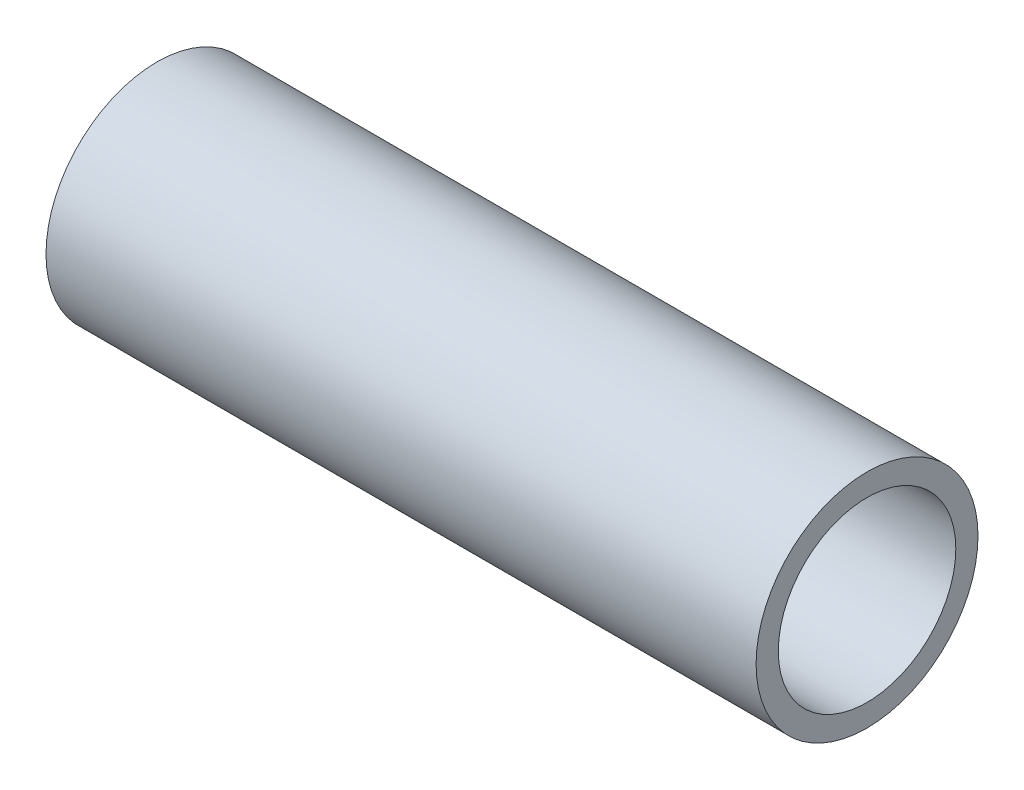
ISO-10303-21;
HEADER;
FILE_DESCRIPTION(('STEP AP214'),'2;1');
FILE_NAME('part.step','',(''),(''),'','','');
FILE_SCHEMA(('AUTOMOTIVE_DESIGN { 1 0 10303 214 1 1 1 1 }'));
ENDSEC;
DATA;
#1=APPLICATION_CONTEXT('core data for automotive mechanical design processes');
#2=APPLICATION_PROTOCOL_DEFINITION('international standard','automotive_design',2000,#1);
#3=PRODUCT_CONTEXT('',#1,'mechanical');
#4=PRODUCT('Part','Part','',(#3));
#5=PRODUCT_RELATED_PRODUCT_CATEGORY('part','',(#4));
#6=PRODUCT_DEFINITION_FORMATION('','',#4);
#7=PRODUCT_DEFINITION_CONTEXT('part definition',#1,'design');
#8=PRODUCT_DEFINITION('design','',#6,#7);
#9=PRODUCT_DEFINITION_SHAPE('','',#8);
#10=(LENGTH_UNIT() NAMED_UNIT(*) SI_UNIT(.MILLI.,.METRE.));
#11=(NAMED_UNIT(*) PLANE_ANGLE_UNIT() SI_UNIT($,.RADIAN.));
#12=(NAMED_UNIT(*) SI_UNIT($,.STERADIAN.) SOLID_ANGLE_UNIT());
#13=UNCERTAINTY_MEASURE_WITH_UNIT(LENGTH_MEASURE(1.E-05),#10,'distance_accuracy_value','');
#14=(GEOMETRIC_REPRESENTATION_CONTEXT(3) GLOBAL_UNCERTAINTY_ASSIGNED_CONTEXT((#13)) GLOBAL_UNIT_ASSIGNED_CONTEXT((#10,
#11,#12)) REPRESENTATION_CONTEXT('',''));
#15=CARTESIAN_POINT('',(0.,0.,0.));
#16=DIRECTION('',(0.,0.,1.));
#17=DIRECTION('',(1.,0.,0.));
#18=AXIS2_PLACEMENT_3D('',#15,#16,#17);
#19=CARTESIAN_POINT('',(50.8,0.,0.));
#20=DIRECTION('',(1.,0.,0.));
#21=DIRECTION('',(0.,0.,-1.));
#22=AXIS2_PLACEMENT_3D('',#19,#20,#21);
#23=PLANE('',#22);
#24=CARTESIAN_POINT('',(50.8,0.,0.));
#25=DIRECTION('',(1.,0.,0.));
#26=DIRECTION('',(0.,0.,-1.));
#27=AXIS2_PLACEMENT_3D('',#24,#25,#26);
#28=CIRCLE('',#27,15.875);
#29=CARTESIAN_POINT('',(50.8,0.,-15.875));
#30=VERTEX_POINT('',#29);
#31=EDGE_CURVE('E10',#30,#30,#28,.T.);
#32=ORIENTED_EDGE('',*,*,#31,.T.);
#33=EDGE_LOOP('',(#32));
#34=FACE_BOUND('',#33,.T.);
#35=CARTESIAN_POINT('',(50.8,0.,0.));
#36=DIRECTION('',(1.,0.,0.));
#37=DIRECTION('',(0.,0.,-1.));
#38=AXIS2_PLACEMENT_3D('',#35,#36,#37);
#39=CIRCLE('',#38,12.7);
#40=CARTESIAN_POINT('',(50.8,0.,-12.7));
#41=VERTEX_POINT('',#40);
#42=EDGE_CURVE('E50',#41,#41,#39,.T.);
#43=ORIENTED_EDGE('',*,*,#42,.F.);
#44=EDGE_LOOP('',(#43));
#45=FACE_BOUND('',#44,.T.);
#46=ADVANCED_FACE('F37',(#34,#45),#23,.T.);
#47=CARTESIAN_POINT('',(-50.8,0.,0.));
#48=DIRECTION('',(1.,0.,0.));
#49=DIRECTION('',(0.,0.,-1.));
#50=AXIS2_PLACEMENT_3D('',#47,#48,#49);
#51=PLANE('',#50);
#52=CARTESIAN_POINT('',(-50.8,0.,0.));
#53=DIRECTION('',(1.,0.,0.));
#54=DIRECTION('',(0.,0.,-1.));
#55=AXIS2_PLACEMENT_3D('',#52,#53,#54);
#56=CIRCLE('',#55,15.875);
#57=CARTESIAN_POINT('',(-50.8,0.,-15.875));
#58=VERTEX_POINT('',#57);
#59=EDGE_CURVE('E41',#58,#58,#56,.T.);
#60=ORIENTED_EDGE('',*,*,#59,.F.);
#61=EDGE_LOOP('',(#60));
#62=FACE_BOUND('',#61,.T.);
#63=CARTESIAN_POINT('',(-50.8,0.,0.));
#64=DIRECTION('',(1.,0.,0.));
#65=DIRECTION('',(0.,0.,-1.));
#66=AXIS2_PLACEMENT_3D('',#63,#64,#65);
#67=CIRCLE('',#66,12.7);
#68=CARTESIAN_POINT('',(-50.8,0.,-12.7));
#69=VERTEX_POINT('',#68);
#70=EDGE_CURVE('E52',#69,#69,#67,.T.);
#71=ORIENTED_EDGE('',*,*,#70,.T.);
#72=EDGE_LOOP('',(#71));
#73=FACE_BOUND('',#72,.T.);
#74=ADVANCED_FACE('F64',(#62,#73),#51,.F.);
#75=CARTESIAN_POINT('',(50.8,0.,0.));
#76=DIRECTION('',(-1.,0.,0.));
#77=DIRECTION('',(0.,0.,1.));
#78=AXIS2_PLACEMENT_3D('',#75,#76,#77);
#79=CYLINDRICAL_SURFACE('',#78,15.875);
#80=ORIENTED_EDGE('',*,*,#31,.F.);
#81=EDGE_LOOP('',(#80));
#82=FACE_BOUND('',#81,.T.);
#83=ORIENTED_EDGE('',*,*,#59,.T.);
#84=EDGE_LOOP('',(#83));
#85=FACE_BOUND('',#84,.T.);
#86=ADVANCED_FACE('F39',(#82,#85),#79,.T.);
#87=CARTESIAN_POINT('',(50.8,0.,0.));
#88=DIRECTION('',(-1.,0.,0.));
#89=DIRECTION('',(0.,0.,1.));
#90=AXIS2_PLACEMENT_3D('',#87,#88,#89);
#91=CYLINDRICAL_SURFACE('',#90,12.7);
#92=ORIENTED_EDGE('',*,*,#42,.T.);
#93=EDGE_LOOP('',(#92));
#94=FACE_BOUND('',#93,.T.);
#95=ORIENTED_EDGE('',*,*,#70,.F.);
#96=EDGE_LOOP('',(#95));
#97=FACE_BOUND('',#96,.T.);
#98=ADVANCED_FACE('F60',(#94,#97),#91,.F.);
#99=CLOSED_SHELL('',(#46,#74,#86,#98));
#100=MANIFOLD_SOLID_BREP('B2',#99);
#101=ADVANCED_BREP_SHAPE_REPRESENTATION('',(#18,#100),#14);
#102=SHAPE_DEFINITION_REPRESENTATION(#9,#101);
ENDSEC;
END-ISO-10303-21;
